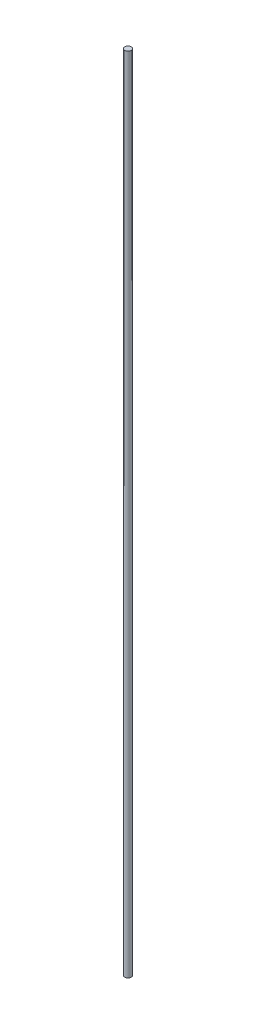
ISO-10303-21;
HEADER;
FILE_DESCRIPTION(('STEP AP214'),'2;1');
FILE_NAME('part.step','',(''),(''),'','','');
FILE_SCHEMA(('AUTOMOTIVE_DESIGN { 1 0 10303 214 1 1 1 1 }'));
ENDSEC;
DATA;
#1=APPLICATION_CONTEXT('core data for automotive mechanical design processes');
#2=APPLICATION_PROTOCOL_DEFINITION('international standard','automotive_design',2000,#1);
#3=PRODUCT_CONTEXT('',#1,'mechanical');
#4=PRODUCT('Part','Part','',(#3));
#5=PRODUCT_RELATED_PRODUCT_CATEGORY('part','',(#4));
#6=PRODUCT_DEFINITION_FORMATION('','',#4);
#7=PRODUCT_DEFINITION_CONTEXT('part definition',#1,'design');
#8=PRODUCT_DEFINITION('design','',#6,#7);
#9=PRODUCT_DEFINITION_SHAPE('','',#8);
#10=(LENGTH_UNIT() NAMED_UNIT(*) SI_UNIT(.MILLI.,.METRE.));
#11=(NAMED_UNIT(*) PLANE_ANGLE_UNIT() SI_UNIT($,.RADIAN.));
#12=(NAMED_UNIT(*) SI_UNIT($,.STERADIAN.) SOLID_ANGLE_UNIT());
#13=UNCERTAINTY_MEASURE_WITH_UNIT(LENGTH_MEASURE(1.E-05),#10,'distance_accuracy_value','');
#14=(GEOMETRIC_REPRESENTATION_CONTEXT(3) GLOBAL_UNCERTAINTY_ASSIGNED_CONTEXT((#13)) GLOBAL_UNIT_ASSIGNED_CONTEXT((#10,
#11,#12)) REPRESENTATION_CONTEXT('',''));
#15=CARTESIAN_POINT('',(0.,0.,0.));
#16=DIRECTION('',(0.,0.,1.));
#17=DIRECTION('',(1.,0.,0.));
#18=AXIS2_PLACEMENT_3D('',#15,#16,#17);
#19=CARTESIAN_POINT('',(0.,500.,0.));
#20=DIRECTION('',(0.,-1.,0.));
#21=DIRECTION('',(0.,0.,-1.));
#22=AXIS2_PLACEMENT_3D('',#19,#20,#21);
#23=CYLINDRICAL_SURFACE('',#22,4.);
#24=CARTESIAN_POINT('',(0.,500.,0.));
#25=DIRECTION('',(0.,1.,0.));
#26=DIRECTION('',(0.,0.,1.));
#27=AXIS2_PLACEMENT_3D('',#24,#25,#26);
#28=CIRCLE('',#27,4.);
#29=CARTESIAN_POINT('',(0.,500.,4.));
#30=VERTEX_POINT('',#29);
#31=EDGE_CURVE('E10',#30,#30,#28,.T.);
#32=ORIENTED_EDGE('',*,*,#31,.F.);
#33=EDGE_LOOP('',(#32));
#34=FACE_BOUND('',#33,.T.);
#35=CARTESIAN_POINT('',(0.,-500.,0.));
#36=DIRECTION('',(0.,1.,0.));
#37=DIRECTION('',(0.,0.,1.));
#38=AXIS2_PLACEMENT_3D('',#35,#36,#37);
#39=CIRCLE('',#38,4.);
#40=CARTESIAN_POINT('',(0.,-500.,4.));
#41=VERTEX_POINT('',#40);
#42=EDGE_CURVE('E46',#41,#41,#39,.T.);
#43=ORIENTED_EDGE('',*,*,#42,.T.);
#44=EDGE_LOOP('',(#43));
#45=FACE_BOUND('',#44,.T.);
#46=ADVANCED_FACE('F43',(#34,#45),#23,.T.);
#47=CARTESIAN_POINT('',(0.,500.,0.));
#48=DIRECTION('',(0.,1.,0.));
#49=DIRECTION('',(0.,0.,1.));
#50=AXIS2_PLACEMENT_3D('',#47,#48,#49);
#51=PLANE('',#50);
#52=ORIENTED_EDGE('',*,*,#31,.T.);
#53=EDGE_LOOP('',(#52));
#54=FACE_BOUND('',#53,.T.);
#55=ADVANCED_FACE('F60',(#54),#51,.T.);
#56=CARTESIAN_POINT('',(0.,-500.,0.));
#57=DIRECTION('',(0.,1.,0.));
#58=DIRECTION('',(0.,0.,1.));
#59=AXIS2_PLACEMENT_3D('',#56,#57,#58);
#60=PLANE('',#59);
#61=ORIENTED_EDGE('',*,*,#42,.F.);
#62=EDGE_LOOP('',(#61));
#63=FACE_BOUND('',#62,.T.);
#64=ADVANCED_FACE('F58',(#63),#60,.F.);
#65=CLOSED_SHELL('',(#46,#55,#64));
#66=MANIFOLD_SOLID_BREP('B2',#65);
#67=ADVANCED_BREP_SHAPE_REPRESENTATION('',(#18,#66),#14);
#68=SHAPE_DEFINITION_REPRESENTATION(#9,#67);
ENDSEC;
END-ISO-10303-21;
